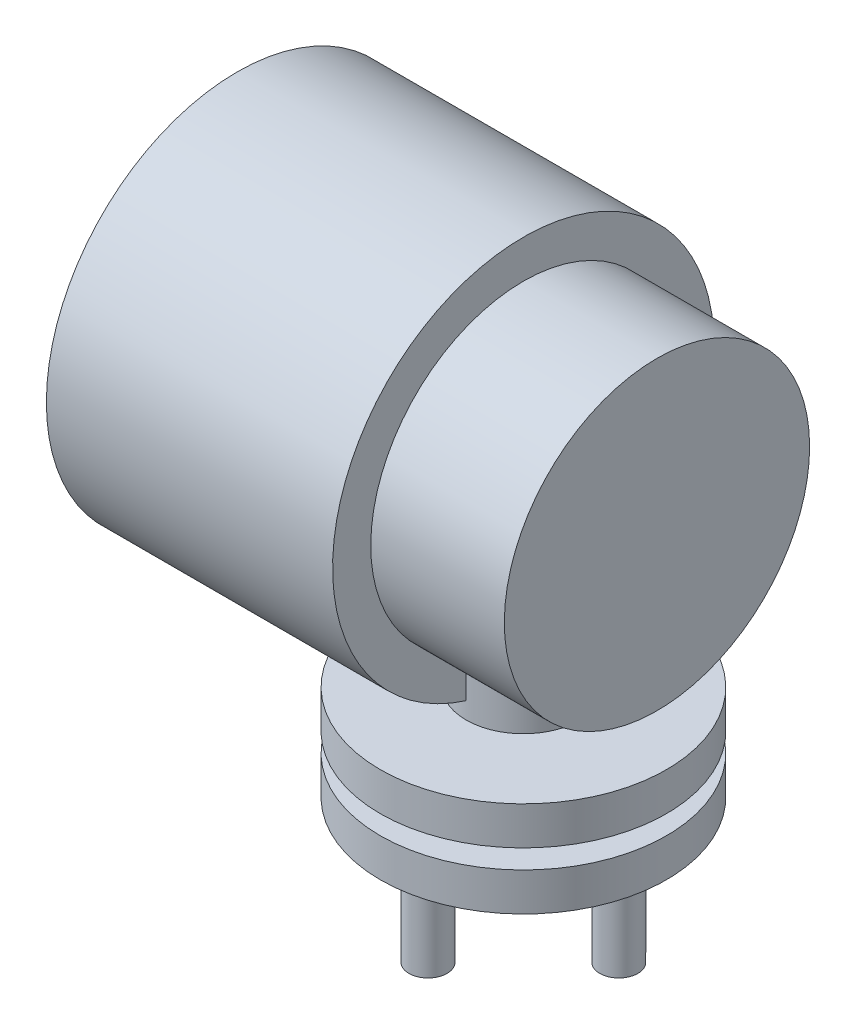
ISO-10303-21;
HEADER;
FILE_DESCRIPTION(('STEP AP214'),'2;1');
FILE_NAME('part.step','',(''),(''),'','','');
FILE_SCHEMA(('AUTOMOTIVE_DESIGN { 1 0 10303 214 1 1 1 1 }'));
ENDSEC;
DATA;
#1=APPLICATION_CONTEXT('core data for automotive mechanical design processes');
#2=APPLICATION_PROTOCOL_DEFINITION('international standard','automotive_design',2000,#1);
#3=PRODUCT_CONTEXT('',#1,'mechanical');
#4=PRODUCT('Part','Part','',(#3));
#5=PRODUCT_RELATED_PRODUCT_CATEGORY('part','',(#4));
#6=PRODUCT_DEFINITION_FORMATION('','',#4);
#7=PRODUCT_DEFINITION_CONTEXT('part definition',#1,'design');
#8=PRODUCT_DEFINITION('design','',#6,#7);
#9=PRODUCT_DEFINITION_SHAPE('','',#8);
#10=(LENGTH_UNIT() NAMED_UNIT(*) SI_UNIT(.MILLI.,.METRE.));
#11=(NAMED_UNIT(*) PLANE_ANGLE_UNIT() SI_UNIT($,.RADIAN.));
#12=(NAMED_UNIT(*) SI_UNIT($,.STERADIAN.) SOLID_ANGLE_UNIT());
#13=UNCERTAINTY_MEASURE_WITH_UNIT(LENGTH_MEASURE(1.E-05),#10,'distance_accuracy_value','');
#14=(GEOMETRIC_REPRESENTATION_CONTEXT(3) GLOBAL_UNCERTAINTY_ASSIGNED_CONTEXT((#13)) GLOBAL_UNIT_ASSIGNED_CONTEXT((#10,
#11,#12)) REPRESENTATION_CONTEXT('',''));
#15=CARTESIAN_POINT('',(0.,0.,0.));
#16=DIRECTION('',(0.,0.,1.));
#17=DIRECTION('',(1.,0.,0.));
#18=AXIS2_PLACEMENT_3D('',#15,#16,#17);
#19=CARTESIAN_POINT('',(0.,150.,0.));
#20=DIRECTION('',(0.,-1.,0.));
#21=DIRECTION('',(0.,0.,-1.));
#22=AXIS2_PLACEMENT_3D('',#19,#20,#21);
#23=CYLINDRICAL_SURFACE('',#22,30.);
#24=CARTESIAN_POINT('',(0.,50.,0.));
#25=DIRECTION('',(0.,1.,0.));
#26=DIRECTION('',(0.,0.,1.));
#27=AXIS2_PLACEMENT_3D('',#24,#25,#26);
#28=CIRCLE('',#27,30.);
#29=CARTESIAN_POINT('',(0.,50.,30.));
#30=VERTEX_POINT('',#29);
#31=EDGE_CURVE('E95',#30,#30,#28,.T.);
#32=ORIENTED_EDGE('',*,*,#31,.T.);
#33=EDGE_LOOP('',(#32));
#34=FACE_BOUND('',#33,.T.);
#35=CARTESIAN_POINT('',(0.,80.0397782301648,30.));
#36=CARTESIAN_POINT('',(0.40579539279083,80.0397879025387,30.0000073395257));
#37=CARTESIAN_POINT('',(0.811585417575759,80.0364478265582,29.9917665920883));
#38=CARTESIAN_POINT('',(1.62238061110944,80.0231395354518,29.9588448257795));
#39=CARTESIAN_POINT('',(2.02738579674918,80.0131714645961,29.9341641647523));
#40=CARTESIAN_POINT('',(2.83572192518221,79.9866828937842,29.8684292848374));
#41=CARTESIAN_POINT('',(3.23905337498199,79.9701645507436,29.8273804557401));
#42=CARTESIAN_POINT('',(4.04338640606967,79.9307221828093,29.7290303732851));
#43=CARTESIAN_POINT('',(4.44438798247671,79.9077981445012,29.6717290858926));
#44=CARTESIAN_POINT('',(5.63996051176829,79.8298666660759,29.4761107876277));
#45=CARTESIAN_POINT('',(6.43016306529853,79.7655971463917,29.3138287836264));
#46=CARTESIAN_POINT('',(7.99280874012618,79.6143667724142,28.9268604665318));
#47=CARTESIAN_POINT('',(8.76525095603184,79.527404764075,28.7021709796151));
#48=CARTESIAN_POINT('',(10.2866659540252,79.3335671687564,28.1926834691583));
#49=CARTESIAN_POINT('',(11.0356598893483,79.2267101718325,27.9079415264612));
#50=CARTESIAN_POINT('',(12.5062898905835,78.9961801300261,27.280613451533));
#51=CARTESIAN_POINT('',(13.227925981781,78.8725071006863,26.9380273727659));
#52=CARTESIAN_POINT('',(14.6402550479721,78.6117177729883,26.197313846308));
#53=CARTESIAN_POINT('',(15.3309242856197,78.4745914103814,25.7991447221056));
#54=CARTESIAN_POINT('',(16.67700757806,78.1906479220418,24.9501636260264));
#55=CARTESIAN_POINT('',(17.332420569718,78.0438305043771,24.4993500679809));
#56=CARTESIAN_POINT('',(18.6331592820346,77.7375408271672,23.526459018209));
#57=CARTESIAN_POINT('',(19.276707305637,77.5777963775227,23.0020890778474));
#58=CARTESIAN_POINT('',(20.5178842579502,77.2561706090069,21.9021477188022));
#59=CARTESIAN_POINT('',(21.1155119320614,77.0942892318937,21.3265749021205));
#60=CARTESIAN_POINT('',(22.2614436825659,76.7726384625389,20.1274927103534));
#61=CARTESIAN_POINT('',(22.8097386993681,76.6128694627974,19.5039745692845));
#62=CARTESIAN_POINT('',(23.8534731540498,76.2996430425896,18.2126618067676));
#63=CARTESIAN_POINT('',(24.3489119290149,76.1461857012981,17.5448666301747));
#64=CARTESIAN_POINT('',(25.2995619388411,75.8445190200705,16.1453373464467));
#65=CARTESIAN_POINT('',(25.7528225132963,75.6966676732512,15.4121987459059));
#66=CARTESIAN_POINT('',(26.5956600696632,75.4161606834532,13.9073573772824));
#67=CARTESIAN_POINT('',(26.9852351740977,75.2835054884988,13.1356534731519));
#68=CARTESIAN_POINT('',(27.6971758191201,75.0372383747024,11.5591623402783));
#69=CARTESIAN_POINT('',(28.0195611532319,74.9236208494671,10.7543849385764));
#70=CARTESIAN_POINT('',(28.5941499419499,74.718725324469,9.11739696552244));
#71=CARTESIAN_POINT('',(28.8463572881372,74.6274460860147,8.2851879182013));
#72=CARTESIAN_POINT('',(29.2686626317384,74.473363683673,6.63613451889494));
#73=CARTESIAN_POINT('',(29.4418324099147,74.4095022942871,5.8201751488959));
#74=CARTESIAN_POINT('',(29.7197575652586,74.306536206528,4.17513733314446));
#75=CARTESIAN_POINT('',(29.8245147354877,74.2674308593117,3.34605923181107));
#76=CARTESIAN_POINT('',(29.9644817536562,74.2151020328293,1.68145495271481));
#77=CARTESIAN_POINT('',(29.9997097098196,74.2018718146395,0.845930510764572));
#78=CARTESIAN_POINT('',(30.0002866860024,74.2016557391656,-0.8251337619089));
#79=CARTESIAN_POINT('',(29.9656378185693,74.2146690884741,-1.66067359140325));
#80=CARTESIAN_POINT('',(29.830292621019,74.2652713700129,-3.28385923236636));
#81=CARTESIAN_POINT('',(29.7329539746228,74.301610645863,-4.07182679206193));
#82=CARTESIAN_POINT('',(29.4764518061509,74.3967067092277,-5.63622487086478));
#83=CARTESIAN_POINT('',(29.3172907060554,74.4554626185381,-6.41265584069687));
#84=CARTESIAN_POINT('',(28.9386117673637,74.5938977354721,-7.94874475410298));
#85=CARTESIAN_POINT('',(28.7190926207766,74.6735773965229,-8.70840233380326));
#86=CARTESIAN_POINT('',(28.2216116158889,74.8518703966128,-10.2060419095514));
#87=CARTESIAN_POINT('',(27.9436482388661,74.9504842276664,-10.9440233417583));
#88=CARTESIAN_POINT('',(27.3270903955946,75.1657887524703,-12.4043295276657));
#89=CARTESIAN_POINT('',(26.987674433351,75.2827210549745,-13.1262715439436));
#90=CARTESIAN_POINT('',(26.2536214729305,75.5307179279836,-14.5389486832708));
#91=CARTESIAN_POINT('',(25.858984272494,75.6617825502507,-15.2296836920055));
#92=CARTESIAN_POINT('',(25.0171411701662,75.9349193726573,-16.5762883887225));
#93=CARTESIAN_POINT('',(24.5699214269451,76.0769944677193,-17.2321488303779));
#94=CARTESIAN_POINT('',(23.625852155539,76.3687406780442,-18.5053302188003));
#95=CARTESIAN_POINT('',(23.1290008004782,76.5184120728175,-19.1226497455655));
#96=CARTESIAN_POINT('',(22.0581537782246,76.8306782140225,-20.350419530541));
#97=CARTESIAN_POINT('',(21.4813460920814,76.9935169018118,-20.9583576992742));
#98=CARTESIAN_POINT('',(20.2789353118229,77.3193830347847,-22.1238764242189));
#99=CARTESIAN_POINT('',(19.6533300749009,77.4824104879472,-22.6814547666983));
#100=CARTESIAN_POINT('',(18.3567478882296,77.8042778852202,-23.7430427892749));
#101=CARTESIAN_POINT('',(17.6857528317753,77.9631161226497,-24.2470308827333));
#102=CARTESIAN_POINT('',(16.3025295618933,78.2720712568554,-25.1978541907368));
#103=CARTESIAN_POINT('',(15.5903022072286,78.4221883351406,-25.6446905949832));
#104=CARTESIAN_POINT('',(14.1121654111187,78.7125825837291,-26.4874854617448));
#105=CARTESIAN_POINT('',(13.3454032217024,78.8525581206962,-26.8820548416311));
#106=CARTESIAN_POINT('',(11.7780480128968,79.1143109731033,-27.6047527182499));
#107=CARTESIAN_POINT('',(10.9774510094884,79.2360861377643,-27.9328733642097));
#108=CARTESIAN_POINT('',(9.34928210739249,79.4571328804903,-28.5190878302284));
#109=CARTESIAN_POINT('',(8.52175091342002,79.5564367630528,-28.7772822820465));
#110=CARTESIAN_POINT('',(6.84529130680359,79.729196526589,-29.2214591998688));
#111=CARTESIAN_POINT('',(5.99637273562403,79.8026640715641,-29.407474255715));
#112=CARTESIAN_POINT('',(4.29262867381386,79.9204550325197,-29.7037475521464));
#113=CARTESIAN_POINT('',(3.4379624917219,79.9650806309272,-29.8147918437874));
#114=CARTESIAN_POINT('',(2.15111855274515,80.009827753634,-29.9258766263631));
#115=CARTESIAN_POINT('',(1.72153690480331,80.0210448593565,-29.9536579105474));
#116=CARTESIAN_POINT('',(0.861324758103332,80.0360247816641,-29.9907231908412));
#117=CARTESIAN_POINT('',(0.430693996328158,80.0397854822567,-30.0000019362698));
#118=CARTESIAN_POINT('',(0.,80.0397782301648,-30.));
#119=B_SPLINE_CURVE_WITH_KNOTS('',3,(#35,#36,#37,#38,#39,#40,#41,#42,#43,#44,#45,#46,#47,#48,
#49,#50,#51,#52,#53,#54,#55,#56,#57,#58,#59,#60,#61,#62,#63,#64,#65,#66,#67,#68,#69,#70,#71,#72,
#73,#74,#75,#76,#77,#78,#79,#80,#81,#82,#83,#84,#85,#86,#87,#88,#89,#90,#91,#92,#93,#94,#95,#96,
#97,#98,#99,#100,#101,#102,#103,#104,#105,#106,#107,#108,#109,#110,#111,#112,#113,#114,#115,
#116,#117,#118),.UNSPECIFIED.,.F.,.F.,(4,2,2,2,2,2,2,2,2,2,2,2,2,2,2,2,2,2,2,2,2,2,2,2,2,2,2,2,
2,2,2,2,2,2,2,2,2,2,2,2,2,4),(0.,1.21727889385095,2.43453129232049,3.6513831985281,
4.8682376529988,7.29275028771033,9.71738624712956,12.1397678731605,14.5621472602576,
16.9863528169917,19.4106314335183,21.9438817475245,24.4772012484077,27.0109850298422,
29.5448005858435,32.1651150851438,34.7855068186038,37.405125512823,40.0245989123231,
42.531113525836,45.0375624421727,47.5433584914931,50.0490787855931,52.430642011003,
54.8121119447908,57.1936334903671,59.5752169294241,61.9913689846536,64.4075298897877,
66.8243282321253,69.2412155665092,71.799417931293,74.3577326956223,76.9170740994167,
79.4763622178597,82.0938864929423,84.7117198426068,87.3257655677455,89.9386296434542,
92.5236543695132,93.8151281351747,95.1069683452501),.UNSPECIFIED.);
#120=CARTESIAN_POINT('',(0.,80.0397782301648,30.));
#121=VERTEX_POINT('',#120);
#122=CARTESIAN_POINT('',(0.,80.0397782301648,-30.));
#123=VERTEX_POINT('',#122);
#124=EDGE_CURVE('E54',#121,#123,#119,.T.);
#125=ORIENTED_EDGE('',*,*,#124,.F.);
#126=DIRECTION('',(0.,-1.,0.));
#127=VECTOR('',#126,1.);
#128=CARTESIAN_POINT('',(0.,150.,30.));
#129=LINE('',#128,#127);
#130=CARTESIAN_POINT('',(0.,58.8078429594269,30.));
#131=VERTEX_POINT('',#130);
#132=EDGE_CURVE('E61',#121,#131,#129,.T.);
#133=ORIENTED_EDGE('',*,*,#132,.T.);
#134=CARTESIAN_POINT('',(0.,58.8078429594269,30.));
#135=CARTESIAN_POINT('',(-0.411696853847507,58.8078474654858,30.0000016465914));
#136=CARTESIAN_POINT('',(-0.823345471288527,58.8051769327793,29.9915240983082));
#137=CARTESIAN_POINT('',(-1.64586321395522,58.7945311956787,29.9576461083608));
#138=CARTESIAN_POINT('',(-2.05673236508141,58.7865561707546,29.9322462392396));
#139=CARTESIAN_POINT('',(-3.28682676320697,58.7547515277061,29.8307453344747));
#140=CARTESIAN_POINT('',(-4.10390269022611,58.7230422634249,29.7293429343204));
#141=CARTESIAN_POINT('',(-5.7238928888373,58.6396883939953,29.4603051313761));
#142=CARTESIAN_POINT('',(-6.52683775293299,58.5880944152745,29.2928379041291));
#143=CARTESIAN_POINT('',(-7.71776687628569,58.4969726858323,28.9931681162346));
#144=CARTESIAN_POINT('',(-8.11252017400425,58.4643077735553,28.8851915264413));
#145=CARTESIAN_POINT('',(-8.89702596368227,58.3946422595519,28.6532768247172));
#146=CARTESIAN_POINT('',(-9.28677724127981,58.3576406262748,28.5293349145113));
#147=CARTESIAN_POINT('',(-10.4469284110616,58.2405887467968,28.1341207902509));
#148=CARTESIAN_POINT('',(-11.2088311298958,58.154444545115,27.8393075942736));
#149=CARTESIAN_POINT('',(-12.7046729490838,57.9684126405507,27.1892697330545));
#150=CARTESIAN_POINT('',(-13.4386111036437,57.8685244733574,26.8340430267744));
#151=CARTESIAN_POINT('',(-14.5151674856254,57.7105003452203,26.2578717443678));
#152=CARTESIAN_POINT('',(-14.8700880800592,57.6564387798433,26.0585109022265));
#153=CARTESIAN_POINT('',(-15.5711664737974,57.5459746440265,25.6457444467873));
#154=CARTESIAN_POINT('',(-15.9173264973093,57.4895726775841,25.4323424489274));
#155=CARTESIAN_POINT('',(-16.9420864703225,57.317393971888,24.7714816311906));
#156=CARTESIAN_POINT('',(-17.6070096380867,57.1986379955127,24.3033447881837));
#157=CARTESIAN_POINT('',(-18.9144527937109,56.9529464444706,23.3011017293805));
#158=CARTESIAN_POINT('',(-19.5557941416024,56.8258742092625,22.7654955879419));
#159=CARTESIAN_POINT('',(-20.7914588190844,56.5702141310477,21.6428277143832));
#160=CARTESIAN_POINT('',(-21.3857812727378,56.4416262598569,21.0557650240841));
#161=CARTESIAN_POINT('',(-22.5237046305128,56.1864087483972,19.8338063570967));
#162=CARTESIAN_POINT('',(-23.0672972221321,56.0597794318796,19.1989025719525));
#163=CARTESIAN_POINT('',(-24.1000886819298,55.8119114534782,17.8852949652361));
#164=CARTESIAN_POINT('',(-24.5892871883703,55.6906728274473,17.2065908524253));
#165=CARTESIAN_POINT('',(-25.519457586839,55.4544284234027,15.7951363164984));
#166=CARTESIAN_POINT('',(-25.9592191254306,55.3396040168212,15.061557027014));
#167=CARTESIAN_POINT('',(-26.7751725102979,55.122223543649,13.5580855076031));
#168=CARTESIAN_POINT('',(-27.1513632084728,55.0196676986405,12.7881926221677));
#169=CARTESIAN_POINT('',(-27.8370138635827,54.8297812021283,11.2176064069145));
#170=CARTESIAN_POINT('',(-28.1464877633683,54.742447370175,10.4169195538902));
#171=CARTESIAN_POINT('',(-28.6960916049933,54.5855182294261,8.79040120555639));
#172=CARTESIAN_POINT('',(-28.9362239197152,54.5159223136452,7.96457057174124));
#173=CARTESIAN_POINT('',(-29.3390898029746,54.3982253292976,6.31788067540471));
#174=CARTESIAN_POINT('',(-29.5038401112551,54.3495665574088,5.49755443219032));
#175=CARTESIAN_POINT('',(-29.764323304671,54.2722908293521,3.8450793134294));
#176=CARTESIAN_POINT('',(-29.8600573815404,54.2436735271195,3.01293064227903));
#177=CARTESIAN_POINT('',(-29.9815998425522,54.2072984544142,1.3432214089331));
#178=CARTESIAN_POINT('',(-30.0074194717559,54.1995373294291,0.505661738769397));
#179=CARTESIAN_POINT('',(-29.9889179743823,54.2050876084533,-1.16860445902703));
#180=CARTESIAN_POINT('',(-29.9445981350525,54.2183986257322,-2.00531100203493));
#181=CARTESIAN_POINT('',(-29.7887749081401,54.2649538960655,-3.6448972702804));
#182=CARTESIAN_POINT('',(-29.6794599031139,54.2975486957585,-4.4480045945686));
#183=CARTESIAN_POINT('',(-29.3964590404347,54.3812564551721,-6.04179049285378));
#184=CARTESIAN_POINT('',(-29.2227747920993,54.4323689519245,-6.83246937706333));
#185=CARTESIAN_POINT('',(-28.8125018026331,54.5517666944704,-8.39601283863162));
#186=CARTESIAN_POINT('',(-28.5759114379064,54.6200523834985,-9.16887695563476));
#187=CARTESIAN_POINT('',(-28.041742187657,54.7720201230656,-10.6916693091853));
#188=CARTESIAN_POINT('',(-27.7441621473015,54.8557024651355,-11.441597111127));
#189=CARTESIAN_POINT('',(-27.0864908924405,55.0373693516697,-12.9223019040715));
#190=CARTESIAN_POINT('',(-26.7257127966786,55.1355089401515,-13.6527546552475));
#191=CARTESIAN_POINT('',(-25.9467420324779,55.3428104345326,-15.0807188951401));
#192=CARTESIAN_POINT('',(-25.5285491328502,55.4519723848144,-15.7782302511982));
#193=CARTESIAN_POINT('',(-24.6375641218611,55.6785477578583,-17.1362206928164));
#194=CARTESIAN_POINT('',(-24.1647619937842,55.7959626928757,-17.796692951358));
#195=CARTESIAN_POINT('',(-23.1677042317755,56.0360438047132,-19.0765716316485));
#196=CARTESIAN_POINT('',(-22.6434473282548,56.1587101110627,-19.6959770394869));
#197=CARTESIAN_POINT('',(-21.5256146152205,56.4109435972014,-20.9130729082772));
#198=CARTESIAN_POINT('',(-20.9301475715969,56.5405946792194,-21.5090103419898));
#199=CARTESIAN_POINT('',(-19.6910604134504,56.7986279250247,-22.6488594191037));
#200=CARTESIAN_POINT('',(-19.047438741379,56.9270100476155,-23.192769378393));
#201=CARTESIAN_POINT('',(-17.715918150193,57.1789494947209,-24.2251132200152));
#202=CARTESIAN_POINT('',(-17.0280056413348,57.3025053195204,-24.7135299470653));
#203=CARTESIAN_POINT('',(-15.6124669804901,57.5412098346143,-25.6312766075881));
#204=CARTESIAN_POINT('',(-14.8848419977233,57.6563587721923,-26.0606082793412));
#205=CARTESIAN_POINT('',(-13.3870234566783,57.8759712310503,-26.8610479334356));
#206=CARTESIAN_POINT('',(-12.616473712351,57.9803148644521,-27.2315229353529));
#207=CARTESIAN_POINT('',(-11.0448111689831,58.1737473534252,-27.9059742671383));
#208=CARTESIAN_POINT('',(-10.243694795807,58.2628344183306,-28.2099427922908));
#209=CARTESIAN_POINT('',(-8.6178482362357,58.4227797240708,-28.7483067894976));
#210=CARTESIAN_POINT('',(-7.79315065706836,58.4936619004905,-28.9827936782755));
#211=CARTESIAN_POINT('',(-6.12550082324516,58.6149901977444,-29.3804750914129));
#212=CARTESIAN_POINT('',(-5.2825571773222,58.665445743885,-29.5437024992297));
#213=CARTESIAN_POINT('',(-4.06706180604218,58.7218898434071,-29.7253564555913));
#214=CARTESIAN_POINT('',(-3.69912868064064,58.7368615019201,-29.7733815320382));
#215=CARTESIAN_POINT('',(-2.96166702768161,58.7625887896282,-29.8557539689542));
#216=CARTESIAN_POINT('',(-2.5921389324629,58.7733454966809,-29.8901048262629));
#217=CARTESIAN_POINT('',(-1.48295480790027,58.7991844983204,-29.9724950871705));
#218=CARTESIAN_POINT('',(-0.741570892484868,58.8078882882116,-30.0000405850312));
#219=CARTESIAN_POINT('',(0.,58.8078429594269,-30.));
#220=B_SPLINE_CURVE_WITH_KNOTS('',3,(#134,#135,#136,#137,#138,#139,#140,#141,#142,#143,#144,
#145,#146,#147,#148,#149,#150,#151,#152,#153,#154,#155,#156,#157,#158,#159,#160,#161,#162,#163,
#164,#165,#166,#167,#168,#169,#170,#171,#172,#173,#174,#175,#176,#177,#178,#179,#180,#181,#182,
#183,#184,#185,#186,#187,#188,#189,#190,#191,#192,#193,#194,#195,#196,#197,#198,#199,#200,#201,
#202,#203,#204,#205,#206,#207,#208,#209,#210,#211,#212,#213,#214,#215,#216,#217,#218,#219),
.UNSPECIFIED.,.F.,.F.,(4,2,2,2,2,2,2,2,2,2,2,2,2,2,2,2,2,2,2,2,2,2,2,2,2,2,2,2,2,2,2,2,2,2,2,2,
2,2,2,2,2,2,4),(0.,1.23489870695709,2.46975563497965,4.93838198769827,7.40076430686813,
8.63211384841008,9.8637568806045,12.3251704382873,14.7866671700429,16.0183282600266,
17.2496734430609,19.7122155851595,22.2449428529318,24.7777172929624,27.310906022746,
29.844111598028,32.4298449830575,35.0156250619122,37.6008642249601,40.1860149101337,
42.6972483864601,45.2084384991596,47.7192246872678,50.2299647962434,52.6606077392857,
55.0911899170876,57.5218348338821,59.9525257789227,62.411491171566,64.8704664658764,
67.3298935169692,69.7893812669238,72.3435198905142,74.8977411627722,77.4527499156481,
80.0076834841672,82.5884648450846,85.1695489054497,87.7472218090155,90.3237039570024,
91.437551909194,92.5511148393489,94.7748253409106),.UNSPECIFIED.);
#221=CARTESIAN_POINT('',(0.,58.8078429594269,-30.));
#222=VERTEX_POINT('',#221);
#223=EDGE_CURVE('E73',#131,#222,#220,.T.);
#224=ORIENTED_EDGE('',*,*,#223,.T.);
#225=DIRECTION('',(0.,-1.,0.));
#226=VECTOR('',#225,1.);
#227=CARTESIAN_POINT('',(0.,150.,-30.));
#228=LINE('',#227,#226);
#229=EDGE_CURVE('E75',#222,#123,#228,.F.);
#230=ORIENTED_EDGE('',*,*,#229,.T.);
#231=EDGE_LOOP('',(#125,#133,#224,#230));
#232=FACE_BOUND('',#231,.T.);
#233=ADVANCED_FACE('F39',(#34,#232),#23,.T.);
#234=CARTESIAN_POINT('',(0.,20.,0.));
#235=DIRECTION('',(0.,-1.,0.));
#236=DIRECTION('',(0.,0.,-1.));
#237=AXIS2_PLACEMENT_3D('',#234,#235,#236);
#238=CYLINDRICAL_SURFACE('',#237,75.);
#239=CARTESIAN_POINT('',(0.,20.,0.));
#240=DIRECTION('',(0.,1.,0.));
#241=DIRECTION('',(0.,0.,1.));
#242=AXIS2_PLACEMENT_3D('',#239,#240,#241);
#243=CIRCLE('',#242,75.);
#244=CARTESIAN_POINT('',(0.,20.,75.));
#245=VERTEX_POINT('',#244);
#246=EDGE_CURVE('E111',#245,#245,#243,.T.);
#247=ORIENTED_EDGE('',*,*,#246,.F.);
#248=EDGE_LOOP('',(#247));
#249=FACE_BOUND('',#248,.T.);
#250=CARTESIAN_POINT('',(0.,0.,0.));
#251=DIRECTION('',(0.,1.,0.));
#252=DIRECTION('',(0.,0.,1.));
#253=AXIS2_PLACEMENT_3D('',#250,#251,#252);
#254=CIRCLE('',#253,75.);
#255=CARTESIAN_POINT('',(0.,0.,75.));
#256=VERTEX_POINT('',#255);
#257=EDGE_CURVE('E107',#256,#256,#254,.T.);
#258=ORIENTED_EDGE('',*,*,#257,.T.);
#259=EDGE_LOOP('',(#258));
#260=FACE_BOUND('',#259,.T.);
#261=ADVANCED_FACE('F41',(#249,#260),#238,.T.);
#262=CARTESIAN_POINT('',(0.,20.,0.));
#263=DIRECTION('',(0.,1.,0.));
#264=DIRECTION('',(0.,0.,1.));
#265=AXIS2_PLACEMENT_3D('',#262,#263,#264);
#266=PLANE('',#265);
#267=CARTESIAN_POINT('',(0.,20.,0.));
#268=DIRECTION('',(0.,1.,0.));
#269=DIRECTION('',(0.,0.,1.));
#270=AXIS2_PLACEMENT_3D('',#267,#268,#269);
#271=CIRCLE('',#270,60.);
#272=CARTESIAN_POINT('',(0.,20.,60.));
#273=VERTEX_POINT('',#272);
#274=EDGE_CURVE('E99',#273,#273,#271,.T.);
#275=ORIENTED_EDGE('',*,*,#274,.F.);
#276=EDGE_LOOP('',(#275));
#277=FACE_BOUND('',#276,.T.);
#278=ORIENTED_EDGE('',*,*,#246,.T.);
#279=EDGE_LOOP('',(#278));
#280=FACE_BOUND('',#279,.T.);
#281=ADVANCED_FACE('F205',(#277,#280),#266,.T.);
#282=CARTESIAN_POINT('',(0.,0.,0.));
#283=DIRECTION('',(0.,1.,0.));
#284=DIRECTION('',(0.,0.,1.));
#285=AXIS2_PLACEMENT_3D('',#282,#283,#284);
#286=PLANE('',#285);
#287=CARTESIAN_POINT('',(0.,0.,0.));
#288=DIRECTION('',(0.,-1.,0.));
#289=DIRECTION('',(0.,0.,-1.));
#290=AXIS2_PLACEMENT_3D('',#287,#288,#289);
#291=CIRCLE('',#290,25.);
#292=CARTESIAN_POINT('',(0.,0.,-25.));
#293=VERTEX_POINT('',#292);
#294=EDGE_CURVE('E162',#293,#293,#291,.T.);
#295=ORIENTED_EDGE('',*,*,#294,.F.);
#296=EDGE_LOOP('',(#295));
#297=FACE_BOUND('',#296,.T.);
#298=CARTESIAN_POINT('',(-50.,0.,0.));
#299=DIRECTION('',(0.,1.,0.));
#300=DIRECTION('',(0.,0.,1.));
#301=AXIS2_PLACEMENT_3D('',#298,#299,#300);
#302=CIRCLE('',#301,10.);
#303=CARTESIAN_POINT('',(-50.,0.,10.));
#304=VERTEX_POINT('',#303);
#305=EDGE_CURVE('E11',#304,#304,#302,.F.);
#306=ORIENTED_EDGE('',*,*,#305,.F.);
#307=EDGE_LOOP('',(#306));
#308=FACE_BOUND('',#307,.T.);
#309=CARTESIAN_POINT('',(0.,0.,50.));
#310=DIRECTION('',(0.,1.,0.));
#311=DIRECTION('',(0.,0.,1.));
#312=AXIS2_PLACEMENT_3D('',#309,#310,#311);
#313=CIRCLE('',#312,10.);
#314=CARTESIAN_POINT('',(0.,0.,60.));
#315=VERTEX_POINT('',#314);
#316=EDGE_CURVE('E48',#315,#315,#313,.F.);
#317=ORIENTED_EDGE('',*,*,#316,.F.);
#318=EDGE_LOOP('',(#317));
#319=FACE_BOUND('',#318,.T.);
#320=CARTESIAN_POINT('',(50.,0.,0.));
#321=DIRECTION('',(0.,1.,0.));
#322=DIRECTION('',(0.,0.,1.));
#323=AXIS2_PLACEMENT_3D('',#320,#321,#322);
#324=CIRCLE('',#323,10.);
#325=CARTESIAN_POINT('',(50.,0.,10.));
#326=VERTEX_POINT('',#325);
#327=EDGE_CURVE('E248',#326,#326,#324,.F.);
#328=ORIENTED_EDGE('',*,*,#327,.F.);
#329=EDGE_LOOP('',(#328));
#330=FACE_BOUND('',#329,.T.);
#331=CARTESIAN_POINT('',(0.,0.,-50.));
#332=DIRECTION('',(0.,1.,0.));
#333=DIRECTION('',(0.,0.,1.));
#334=AXIS2_PLACEMENT_3D('',#331,#332,#333);
#335=CIRCLE('',#334,10.);
#336=CARTESIAN_POINT('',(0.,0.,-40.));
#337=VERTEX_POINT('',#336);
#338=EDGE_CURVE('E72',#337,#337,#335,.F.);
#339=ORIENTED_EDGE('',*,*,#338,.F.);
#340=EDGE_LOOP('',(#339));
#341=FACE_BOUND('',#340,.T.);
#342=ORIENTED_EDGE('',*,*,#257,.F.);
#343=EDGE_LOOP('',(#342));
#344=FACE_BOUND('',#343,.T.);
#345=ADVANCED_FACE('F229',(#297,#308,#319,#330,#341,#344),#286,.F.);
#346=CARTESIAN_POINT('',(0.,30.,0.));
#347=DIRECTION('',(0.,-1.,0.));
#348=DIRECTION('',(0.,0.,-1.));
#349=AXIS2_PLACEMENT_3D('',#346,#347,#348);
#350=CYLINDRICAL_SURFACE('',#349,60.);
#351=CARTESIAN_POINT('',(0.,30.,0.));
#352=DIRECTION('',(0.,1.,0.));
#353=DIRECTION('',(0.,0.,1.));
#354=AXIS2_PLACEMENT_3D('',#351,#352,#353);
#355=CIRCLE('',#354,60.);
#356=CARTESIAN_POINT('',(0.,30.,60.));
#357=VERTEX_POINT('',#356);
#358=EDGE_CURVE('E102',#357,#357,#355,.T.);
#359=ORIENTED_EDGE('',*,*,#358,.F.);
#360=EDGE_LOOP('',(#359));
#361=FACE_BOUND('',#360,.T.);
#362=ORIENTED_EDGE('',*,*,#274,.T.);
#363=EDGE_LOOP('',(#362));
#364=FACE_BOUND('',#363,.T.);
#365=ADVANCED_FACE('F217',(#361,#364),#350,.T.);
#366=CARTESIAN_POINT('',(0.,50.,0.));
#367=DIRECTION('',(0.,-1.,0.));
#368=DIRECTION('',(0.,0.,-1.));
#369=AXIS2_PLACEMENT_3D('',#366,#367,#368);
#370=CYLINDRICAL_SURFACE('',#369,75.);
#371=CARTESIAN_POINT('',(0.,50.,0.));
#372=DIRECTION('',(0.,1.,0.));
#373=DIRECTION('',(0.,0.,1.));
#374=AXIS2_PLACEMENT_3D('',#371,#372,#373);
#375=CIRCLE('',#374,75.);
#376=CARTESIAN_POINT('',(0.,50.,75.));
#377=VERTEX_POINT('',#376);
#378=EDGE_CURVE('E89',#377,#377,#375,.T.);
#379=ORIENTED_EDGE('',*,*,#378,.F.);
#380=EDGE_LOOP('',(#379));
#381=FACE_BOUND('',#380,.T.);
#382=CARTESIAN_POINT('',(0.,30.,0.));
#383=DIRECTION('',(0.,1.,0.));
#384=DIRECTION('',(0.,0.,1.));
#385=AXIS2_PLACEMENT_3D('',#382,#383,#384);
#386=CIRCLE('',#385,75.);
#387=CARTESIAN_POINT('',(0.,30.,75.));
#388=VERTEX_POINT('',#387);
#389=EDGE_CURVE('E84',#388,#388,#386,.T.);
#390=ORIENTED_EDGE('',*,*,#389,.T.);
#391=EDGE_LOOP('',(#390));
#392=FACE_BOUND('',#391,.T.);
#393=ADVANCED_FACE('F212',(#381,#392),#370,.T.);
#394=CARTESIAN_POINT('',(0.,50.,0.));
#395=DIRECTION('',(0.,1.,0.));
#396=DIRECTION('',(0.,0.,1.));
#397=AXIS2_PLACEMENT_3D('',#394,#395,#396);
#398=PLANE('',#397);
#399=ORIENTED_EDGE('',*,*,#31,.F.);
#400=EDGE_LOOP('',(#399));
#401=FACE_BOUND('',#400,.T.);
#402=ORIENTED_EDGE('',*,*,#378,.T.);
#403=EDGE_LOOP('',(#402));
#404=FACE_BOUND('',#403,.T.);
#405=ADVANCED_FACE('F209',(#401,#404),#398,.T.);
#406=CARTESIAN_POINT('',(0.,30.,0.));
#407=DIRECTION('',(0.,1.,0.));
#408=DIRECTION('',(0.,0.,1.));
#409=AXIS2_PLACEMENT_3D('',#406,#407,#408);
#410=PLANE('',#409);
#411=ORIENTED_EDGE('',*,*,#358,.T.);
#412=EDGE_LOOP('',(#411));
#413=FACE_BOUND('',#412,.T.);
#414=ORIENTED_EDGE('',*,*,#389,.F.);
#415=EDGE_LOOP('',(#414));
#416=FACE_BOUND('',#415,.T.);
#417=ADVANCED_FACE('F132',(#413,#416),#410,.F.);
#418=CARTESIAN_POINT('',(-150.,154.201763101121,0.));
#419=DIRECTION('',(1.,0.,0.));
#420=DIRECTION('',(0.,0.,-1.));
#421=AXIS2_PLACEMENT_3D('',#418,#419,#420);
#422=CYLINDRICAL_SURFACE('',#421,100.);
#423=CARTESIAN_POINT('',(-150.,154.201763101121,0.));
#424=DIRECTION('',(1.,0.,0.));
#425=DIRECTION('',(0.,0.,-1.));
#426=AXIS2_PLACEMENT_3D('',#423,#424,#425);
#427=CIRCLE('',#426,100.);
#428=CARTESIAN_POINT('',(-150.,154.201763101121,-100.));
#429=VERTEX_POINT('',#428);
#430=EDGE_CURVE('E91',#429,#429,#427,.T.);
#431=ORIENTED_EDGE('',*,*,#430,.T.);
#432=EDGE_LOOP('',(#431));
#433=FACE_BOUND('',#432,.T.);
#434=ORIENTED_EDGE('',*,*,#223,.F.);
#435=CARTESIAN_POINT('',(0.,154.201763101121,0.));
#436=DIRECTION('',(1.,0.,0.));
#437=DIRECTION('',(0.,0.,-1.));
#438=AXIS2_PLACEMENT_3D('',#435,#436,#437);
#439=CIRCLE('',#438,100.);
#440=EDGE_CURVE('E77',#222,#131,#439,.T.);
#441=ORIENTED_EDGE('',*,*,#440,.F.);
#442=EDGE_LOOP('',(#434,#441));
#443=FACE_BOUND('',#442,.T.);
#444=ADVANCED_FACE('F128',(#433,#443),#422,.T.);
#445=CARTESIAN_POINT('',(0.,154.201763101121,0.));
#446=DIRECTION('',(1.,0.,0.));
#447=DIRECTION('',(0.,0.,-1.));
#448=AXIS2_PLACEMENT_3D('',#445,#446,#447);
#449=PLANE('',#448);
#450=ORIENTED_EDGE('',*,*,#132,.F.);
#451=CARTESIAN_POINT('',(0.,154.201763101121,0.));
#452=DIRECTION('',(1.,0.,0.));
#453=DIRECTION('',(0.,0.,-1.));
#454=AXIS2_PLACEMENT_3D('',#451,#452,#453);
#455=CIRCLE('',#454,80.);
#456=EDGE_CURVE('E66',#121,#123,#455,.F.);
#457=ORIENTED_EDGE('',*,*,#456,.T.);
#458=ORIENTED_EDGE('',*,*,#229,.F.);
#459=ORIENTED_EDGE('',*,*,#440,.T.);
#460=EDGE_LOOP('',(#450,#457,#458,#459));
#461=FACE_BOUND('',#460,.T.);
#462=ADVANCED_FACE('F81',(#461),#449,.T.);
#463=CARTESIAN_POINT('',(-150.,154.201763101121,0.));
#464=DIRECTION('',(1.,0.,0.));
#465=DIRECTION('',(0.,0.,-1.));
#466=AXIS2_PLACEMENT_3D('',#463,#464,#465);
#467=PLANE('',#466);
#468=ORIENTED_EDGE('',*,*,#430,.F.);
#469=EDGE_LOOP('',(#468));
#470=FACE_BOUND('',#469,.T.);
#471=ADVANCED_FACE('F136',(#470),#467,.F.);
#472=CARTESIAN_POINT('',(70.,154.201763101121,0.));
#473=DIRECTION('',(-1.,0.,0.));
#474=DIRECTION('',(0.,0.,1.));
#475=AXIS2_PLACEMENT_3D('',#472,#473,#474);
#476=CYLINDRICAL_SURFACE('',#475,80.);
#477=CARTESIAN_POINT('',(70.,154.201763101121,0.));
#478=DIRECTION('',(1.,0.,0.));
#479=DIRECTION('',(0.,0.,-1.));
#480=AXIS2_PLACEMENT_3D('',#477,#478,#479);
#481=CIRCLE('',#480,80.);
#482=CARTESIAN_POINT('',(70.,154.201763101121,-80.));
#483=VERTEX_POINT('',#482);
#484=EDGE_CURVE('E78',#483,#483,#481,.T.);
#485=ORIENTED_EDGE('',*,*,#484,.F.);
#486=EDGE_LOOP('',(#485));
#487=FACE_BOUND('',#486,.T.);
#488=ORIENTED_EDGE('',*,*,#456,.F.);
#489=ORIENTED_EDGE('',*,*,#124,.T.);
#490=EDGE_LOOP('',(#488,#489));
#491=FACE_BOUND('',#490,.T.);
#492=ADVANCED_FACE('F67',(#487,#491),#476,.T.);
#493=CARTESIAN_POINT('',(70.,154.201763101121,0.));
#494=DIRECTION('',(1.,0.,0.));
#495=DIRECTION('',(0.,0.,-1.));
#496=AXIS2_PLACEMENT_3D('',#493,#494,#495);
#497=PLANE('',#496);
#498=ORIENTED_EDGE('',*,*,#484,.T.);
#499=EDGE_LOOP('',(#498));
#500=FACE_BOUND('',#499,.T.);
#501=ADVANCED_FACE('F143',(#500),#497,.T.);
#502=CARTESIAN_POINT('',(0.,-40.,-50.));
#503=DIRECTION('',(0.,1.,0.));
#504=DIRECTION('',(0.,0.,1.));
#505=AXIS2_PLACEMENT_3D('',#502,#503,#504);
#506=CYLINDRICAL_SURFACE('',#505,10.);
#507=ORIENTED_EDGE('',*,*,#338,.T.);
#508=EDGE_LOOP('',(#507));
#509=FACE_BOUND('',#508,.T.);
#510=CARTESIAN_POINT('',(0.,-50.,-50.));
#511=DIRECTION('',(0.,-1.,0.));
#512=DIRECTION('',(0.,0.,-1.));
#513=AXIS2_PLACEMENT_3D('',#510,#511,#512);
#514=CIRCLE('',#513,10.);
#515=CARTESIAN_POINT('',(0.,-50.,-60.));
#516=VERTEX_POINT('',#515);
#517=EDGE_CURVE('E166',#516,#516,#514,.T.);
#518=ORIENTED_EDGE('',*,*,#517,.F.);
#519=EDGE_LOOP('',(#518));
#520=FACE_BOUND('',#519,.T.);
#521=ADVANCED_FACE('F188',(#509,#520),#506,.T.);
#522=CARTESIAN_POINT('',(50.,-40.,0.));
#523=DIRECTION('',(0.,1.,0.));
#524=DIRECTION('',(0.,0.,1.));
#525=AXIS2_PLACEMENT_3D('',#522,#523,#524);
#526=CYLINDRICAL_SURFACE('',#525,10.);
#527=ORIENTED_EDGE('',*,*,#327,.T.);
#528=EDGE_LOOP('',(#527));
#529=FACE_BOUND('',#528,.T.);
#530=CARTESIAN_POINT('',(50.,-50.,0.));
#531=DIRECTION('',(0.,-1.,0.));
#532=DIRECTION('',(0.,0.,-1.));
#533=AXIS2_PLACEMENT_3D('',#530,#531,#532);
#534=CIRCLE('',#533,10.);
#535=CARTESIAN_POINT('',(50.,-50.,-10.));
#536=VERTEX_POINT('',#535);
#537=EDGE_CURVE('E177',#536,#536,#534,.T.);
#538=ORIENTED_EDGE('',*,*,#537,.F.);
#539=EDGE_LOOP('',(#538));
#540=FACE_BOUND('',#539,.T.);
#541=ADVANCED_FACE('F185',(#529,#540),#526,.T.);
#542=CARTESIAN_POINT('',(0.,-40.,50.));
#543=DIRECTION('',(0.,1.,0.));
#544=DIRECTION('',(0.,0.,1.));
#545=AXIS2_PLACEMENT_3D('',#542,#543,#544);
#546=CYLINDRICAL_SURFACE('',#545,10.);
#547=ORIENTED_EDGE('',*,*,#316,.T.);
#548=EDGE_LOOP('',(#547));
#549=FACE_BOUND('',#548,.T.);
#550=CARTESIAN_POINT('',(0.,-50.,50.));
#551=DIRECTION('',(0.,-1.,0.));
#552=DIRECTION('',(0.,0.,-1.));
#553=AXIS2_PLACEMENT_3D('',#550,#551,#552);
#554=CIRCLE('',#553,10.);
#555=CARTESIAN_POINT('',(0.,-50.,40.));
#556=VERTEX_POINT('',#555);
#557=EDGE_CURVE('E173',#556,#556,#554,.T.);
#558=ORIENTED_EDGE('',*,*,#557,.F.);
#559=EDGE_LOOP('',(#558));
#560=FACE_BOUND('',#559,.T.);
#561=ADVANCED_FACE('F187',(#549,#560),#546,.T.);
#562=CARTESIAN_POINT('',(-50.,-40.,0.));
#563=DIRECTION('',(0.,1.,0.));
#564=DIRECTION('',(0.,0.,1.));
#565=AXIS2_PLACEMENT_3D('',#562,#563,#564);
#566=CYLINDRICAL_SURFACE('',#565,10.);
#567=ORIENTED_EDGE('',*,*,#305,.T.);
#568=EDGE_LOOP('',(#567));
#569=FACE_BOUND('',#568,.T.);
#570=CARTESIAN_POINT('',(-50.,-50.,0.));
#571=DIRECTION('',(0.,-1.,0.));
#572=DIRECTION('',(0.,0.,-1.));
#573=AXIS2_PLACEMENT_3D('',#570,#571,#572);
#574=CIRCLE('',#573,10.);
#575=CARTESIAN_POINT('',(-50.,-50.,-10.));
#576=VERTEX_POINT('',#575);
#577=EDGE_CURVE('E169',#576,#576,#574,.T.);
#578=ORIENTED_EDGE('',*,*,#577,.F.);
#579=EDGE_LOOP('',(#578));
#580=FACE_BOUND('',#579,.T.);
#581=ADVANCED_FACE('F195',(#569,#580),#566,.T.);
#582=CARTESIAN_POINT('',(0.,120.,0.));
#583=DIRECTION('',(0.,-1.,0.));
#584=DIRECTION('',(0.,0.,-1.));
#585=AXIS2_PLACEMENT_3D('',#582,#583,#584);
#586=CYLINDRICAL_SURFACE('',#585,25.);
#587=CARTESIAN_POINT('',(0.,120.,0.));
#588=DIRECTION('',(0.,-1.,0.));
#589=DIRECTION('',(0.,0.,-1.));
#590=AXIS2_PLACEMENT_3D('',#587,#588,#589);
#591=CIRCLE('',#590,25.);
#592=CARTESIAN_POINT('',(0.,120.,-25.));
#593=VERTEX_POINT('',#592);
#594=EDGE_CURVE('E159',#593,#593,#591,.T.);
#595=CARTESIAN_POINT('',(0.,120.,-25.));
#596=CARTESIAN_POINT('',(0.,118.75,-25.));
#597=CARTESIAN_POINT('',(0.,117.5,-25.));
#598=CARTESIAN_POINT('',(0.,115.,-25.));
#599=CARTESIAN_POINT('',(0.,113.75,-25.));
#600=CARTESIAN_POINT('',(0.,111.25,-25.));
#601=CARTESIAN_POINT('',(0.,110.,-25.));
#602=CARTESIAN_POINT('',(0.,107.5,-25.));
#603=CARTESIAN_POINT('',(0.,106.25,-25.));
#604=CARTESIAN_POINT('',(0.,103.75,-25.));
#605=CARTESIAN_POINT('',(0.,102.5,-25.));
#606=CARTESIAN_POINT('',(0.,100.,-25.));
#607=CARTESIAN_POINT('',(0.,98.75,-25.));
#608=CARTESIAN_POINT('',(0.,96.25,-25.));
#609=CARTESIAN_POINT('',(0.,95.,-25.));
#610=CARTESIAN_POINT('',(0.,92.5,-25.));
#611=CARTESIAN_POINT('',(0.,91.25,-25.));
#612=CARTESIAN_POINT('',(0.,88.75,-25.));
#613=CARTESIAN_POINT('',(0.,87.5,-25.));
#614=CARTESIAN_POINT('',(0.,85.,-25.));
#615=CARTESIAN_POINT('',(0.,83.75,-25.));
#616=CARTESIAN_POINT('',(0.,81.25,-25.));
#617=CARTESIAN_POINT('',(0.,80.,-25.));
#618=CARTESIAN_POINT('',(0.,77.5,-25.));
#619=CARTESIAN_POINT('',(0.,76.25,-25.));
#620=CARTESIAN_POINT('',(0.,73.75,-25.));
#621=CARTESIAN_POINT('',(0.,72.5,-25.));
#622=CARTESIAN_POINT('',(0.,70.,-25.));
#623=CARTESIAN_POINT('',(0.,68.75,-25.));
#624=CARTESIAN_POINT('',(0.,66.25,-25.));
#625=CARTESIAN_POINT('',(0.,65.,-25.));
#626=CARTESIAN_POINT('',(0.,62.5,-25.));
#627=CARTESIAN_POINT('',(0.,61.25,-25.));
#628=CARTESIAN_POINT('',(0.,58.75,-25.));
#629=CARTESIAN_POINT('',(0.,57.5,-25.));
#630=CARTESIAN_POINT('',(0.,55.,-25.));
#631=CARTESIAN_POINT('',(0.,53.75,-25.));
#632=CARTESIAN_POINT('',(0.,51.25,-25.));
#633=CARTESIAN_POINT('',(0.,50.,-25.));
#634=CARTESIAN_POINT('',(0.,47.5,-25.));
#635=CARTESIAN_POINT('',(0.,46.25,-25.));
#636=CARTESIAN_POINT('',(0.,43.75,-25.));
#637=CARTESIAN_POINT('',(0.,42.5,-25.));
#638=CARTESIAN_POINT('',(0.,40.,-25.));
#639=CARTESIAN_POINT('',(0.,38.75,-25.));
#640=CARTESIAN_POINT('',(0.,36.25,-25.));
#641=CARTESIAN_POINT('',(0.,35.,-25.));
#642=CARTESIAN_POINT('',(0.,32.5,-25.));
#643=CARTESIAN_POINT('',(0.,31.25,-25.));
#644=CARTESIAN_POINT('',(0.,28.75,-25.));
#645=CARTESIAN_POINT('',(0.,27.5,-25.));
#646=CARTESIAN_POINT('',(0.,25.,-25.));
#647=CARTESIAN_POINT('',(0.,23.75,-25.));
#648=CARTESIAN_POINT('',(0.,21.25,-25.));
#649=CARTESIAN_POINT('',(0.,20.,-25.));
#650=CARTESIAN_POINT('',(0.,17.5,-25.));
#651=CARTESIAN_POINT('',(0.,16.25,-25.));
#652=CARTESIAN_POINT('',(0.,13.75,-25.));
#653=CARTESIAN_POINT('',(0.,12.5,-25.));
#654=CARTESIAN_POINT('',(0.,10.,-25.));
#655=CARTESIAN_POINT('',(0.,8.75,-25.));
#656=CARTESIAN_POINT('',(0.,6.25000000000001,-25.));
#657=CARTESIAN_POINT('',(0.,5.,-25.));
#658=CARTESIAN_POINT('',(0.,2.5,-25.));
#659=CARTESIAN_POINT('',(0.,1.25,-25.));
#660=CARTESIAN_POINT('',(0.,0.,-25.));
#661=B_SPLINE_CURVE_WITH_KNOTS('',3,(#595,#596,#597,#598,#599,#600,#601,#602,#603,#604,#605,
#606,#607,#608,#609,#610,#611,#612,#613,#614,#615,#616,#617,#618,#619,#620,#621,#622,#623,#624,
#625,#626,#627,#628,#629,#630,#631,#632,#633,#634,#635,#636,#637,#638,#639,#640,#641,#642,#643,
#644,#645,#646,#647,#648,#649,#650,#651,#652,#653,#654,#655,#656,#657,#658,#659,#660),
.UNSPECIFIED.,.F.,.F.,(4,2,2,2,2,2,2,2,2,2,2,2,2,2,2,2,2,2,2,2,2,2,2,2,2,2,2,2,2,2,2,2,4),(0.,
3.75,7.50000000000001,11.25,15.,18.75,22.5,26.25,30.,33.75,37.5,41.25,45.,48.75,52.5,56.25,60.,
63.75,67.5,71.25,75.,78.75,82.5,86.25,90.,93.75,97.5,101.25,105.,108.75,112.5,116.25,120.),.UNSPECIFIED.);
#662=EDGE_CURVE('BSEAM280',#593,#293,#661,.T.);
#663=ORIENTED_EDGE('',*,*,#594,.F.);
#664=ORIENTED_EDGE('',*,*,#294,.T.);
#665=ORIENTED_EDGE('',*,*,#662,.T.);
#666=ORIENTED_EDGE('',*,*,#662,.F.);
#667=EDGE_LOOP('',(#663,#665,#664,#666));
#668=FACE_BOUND('',#667,.T.);
#669=ADVANCED_FACE('F280',(#668),#586,.F.);
#670=CARTESIAN_POINT('',(0.,120.,0.));
#671=DIRECTION('',(0.,-1.,0.));
#672=DIRECTION('',(0.,0.,-1.));
#673=AXIS2_PLACEMENT_3D('',#670,#671,#672);
#674=PLANE('',#673);
#675=ORIENTED_EDGE('',*,*,#594,.T.);
#676=EDGE_LOOP('',(#675));
#677=FACE_BOUND('',#676,.T.);
#678=ADVANCED_FACE('F276',(#677),#674,.T.);
#679=CARTESIAN_POINT('',(0.,-50.,-50.));
#680=DIRECTION('',(0.,-1.,0.));
#681=DIRECTION('',(0.,0.,-1.));
#682=AXIS2_PLACEMENT_3D('',#679,#680,#681);
#683=PLANE('',#682);
#684=ORIENTED_EDGE('',*,*,#517,.T.);
#685=EDGE_LOOP('',(#684));
#686=FACE_BOUND('',#685,.T.);
#687=ADVANCED_FACE('F270',(#686),#683,.T.);
#688=CARTESIAN_POINT('',(-50.,-50.,0.));
#689=DIRECTION('',(0.,-1.,0.));
#690=DIRECTION('',(0.,0.,-1.));
#691=AXIS2_PLACEMENT_3D('',#688,#689,#690);
#692=PLANE('',#691);
#693=ORIENTED_EDGE('',*,*,#577,.T.);
#694=EDGE_LOOP('',(#693));
#695=FACE_BOUND('',#694,.T.);
#696=ADVANCED_FACE('F263',(#695),#692,.T.);
#697=CARTESIAN_POINT('',(0.,-50.,50.));
#698=DIRECTION('',(0.,-1.,0.));
#699=DIRECTION('',(0.,0.,-1.));
#700=AXIS2_PLACEMENT_3D('',#697,#698,#699);
#701=PLANE('',#700);
#702=ORIENTED_EDGE('',*,*,#557,.T.);
#703=EDGE_LOOP('',(#702));
#704=FACE_BOUND('',#703,.T.);
#705=ADVANCED_FACE('F261',(#704),#701,.T.);
#706=CARTESIAN_POINT('',(50.,-50.,0.));
#707=DIRECTION('',(0.,-1.,0.));
#708=DIRECTION('',(0.,0.,-1.));
#709=AXIS2_PLACEMENT_3D('',#706,#707,#708);
#710=PLANE('',#709);
#711=ORIENTED_EDGE('',*,*,#537,.T.);
#712=EDGE_LOOP('',(#711));
#713=FACE_BOUND('',#712,.T.);
#714=ADVANCED_FACE('F183',(#713),#710,.T.);
#715=CLOSED_SHELL('',(#233,#261,#281,#345,#365,#393,#405,#417,#444,#462,#471,#492,#501,#521,
#541,#561,#581,#669,#678,#687,#696,#705,#714));
#716=MANIFOLD_SOLID_BREP('B2',#715);
#717=ADVANCED_BREP_SHAPE_REPRESENTATION('',(#18,#716),#14);
#718=SHAPE_DEFINITION_REPRESENTATION(#9,#717);
ENDSEC;
END-ISO-10303-21;
